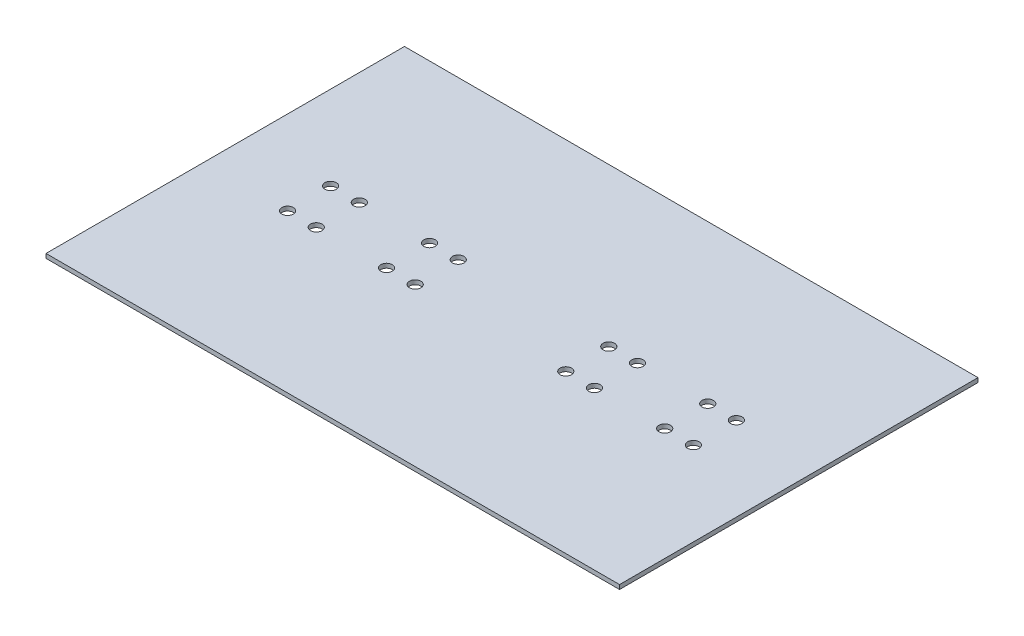
ISO-10303-21;
HEADER;
FILE_DESCRIPTION(('STEP AP214'),'2;1');
FILE_NAME('part.step','',(''),(''),'','','');
FILE_SCHEMA(('AUTOMOTIVE_DESIGN { 1 0 10303 214 1 1 1 1 }'));
ENDSEC;
DATA;
#1=APPLICATION_CONTEXT('core data for automotive mechanical design processes');
#2=APPLICATION_PROTOCOL_DEFINITION('international standard','automotive_design',2000,#1);
#3=PRODUCT_CONTEXT('',#1,'mechanical');
#4=PRODUCT('Part','Part','',(#3));
#5=PRODUCT_RELATED_PRODUCT_CATEGORY('part','',(#4));
#6=PRODUCT_DEFINITION_FORMATION('','',#4);
#7=PRODUCT_DEFINITION_CONTEXT('part definition',#1,'design');
#8=PRODUCT_DEFINITION('design','',#6,#7);
#9=PRODUCT_DEFINITION_SHAPE('','',#8);
#10=(LENGTH_UNIT() NAMED_UNIT(*) SI_UNIT(.MILLI.,.METRE.));
#11=(NAMED_UNIT(*) PLANE_ANGLE_UNIT() SI_UNIT($,.RADIAN.));
#12=(NAMED_UNIT(*) SI_UNIT($,.STERADIAN.) SOLID_ANGLE_UNIT());
#13=UNCERTAINTY_MEASURE_WITH_UNIT(LENGTH_MEASURE(1.E-05),#10,'distance_accuracy_value','');
#14=(GEOMETRIC_REPRESENTATION_CONTEXT(3) GLOBAL_UNCERTAINTY_ASSIGNED_CONTEXT((#13)) GLOBAL_UNIT_ASSIGNED_CONTEXT((#10,
#11,#12)) REPRESENTATION_CONTEXT('',''));
#15=CARTESIAN_POINT('',(0.,0.,0.));
#16=DIRECTION('',(0.,0.,1.));
#17=DIRECTION('',(1.,0.,0.));
#18=AXIS2_PLACEMENT_3D('',#15,#16,#17);
#19=CARTESIAN_POINT('',(200.,3.,125.));
#20=DIRECTION('',(-1.,0.,0.));
#21=DIRECTION('',(0.,0.,1.));
#22=AXIS2_PLACEMENT_3D('',#19,#20,#21);
#23=PLANE('',#22);
#24=DIRECTION('',(0.,0.,-1.));
#25=VECTOR('',#24,1.);
#26=CARTESIAN_POINT('',(200.,0.,125.));
#27=LINE('',#26,#25);
#28=CARTESIAN_POINT('',(200.,0.,125.));
#29=VERTEX_POINT('',#28);
#30=CARTESIAN_POINT('',(200.,0.,-125.));
#31=VERTEX_POINT('',#30);
#32=EDGE_CURVE('E101',#29,#31,#27,.T.);
#33=ORIENTED_EDGE('',*,*,#32,.T.);
#34=DIRECTION('',(0.,-1.,0.));
#35=VECTOR('',#34,1.);
#36=CARTESIAN_POINT('',(200.,3.,-125.));
#37=LINE('',#36,#35);
#38=CARTESIAN_POINT('',(200.,3.,-125.));
#39=VERTEX_POINT('',#38);
#40=EDGE_CURVE('E11',#39,#31,#37,.T.);
#41=ORIENTED_EDGE('',*,*,#40,.F.);
#42=DIRECTION('',(0.,0.,-1.));
#43=VECTOR('',#42,1.);
#44=CARTESIAN_POINT('',(200.,3.,125.));
#45=LINE('',#44,#43);
#46=CARTESIAN_POINT('',(200.,3.,125.));
#47=VERTEX_POINT('',#46);
#48=EDGE_CURVE('E89',#47,#39,#45,.T.);
#49=ORIENTED_EDGE('',*,*,#48,.F.);
#50=DIRECTION('',(0.,-1.,0.));
#51=VECTOR('',#50,1.);
#52=CARTESIAN_POINT('',(200.,3.,125.));
#53=LINE('',#52,#51);
#54=EDGE_CURVE('E97',#47,#29,#53,.T.);
#55=ORIENTED_EDGE('',*,*,#54,.T.);
#56=EDGE_LOOP('',(#33,#41,#49,#55));
#57=FACE_BOUND('',#56,.T.);
#58=ADVANCED_FACE('F38',(#57),#23,.F.);
#59=CARTESIAN_POINT('',(-200.,3.,-125.));
#60=DIRECTION('',(0.,0.,1.));
#61=DIRECTION('',(1.,0.,0.));
#62=AXIS2_PLACEMENT_3D('',#59,#60,#61);
#63=PLANE('',#62);
#64=DIRECTION('',(-1.,0.,0.));
#65=VECTOR('',#64,1.);
#66=CARTESIAN_POINT('',(-200.,0.,-125.));
#67=LINE('',#66,#65);
#68=CARTESIAN_POINT('',(-200.,0.,-125.));
#69=VERTEX_POINT('',#68);
#70=EDGE_CURVE('E93',#31,#69,#67,.T.);
#71=ORIENTED_EDGE('',*,*,#70,.T.);
#72=DIRECTION('',(0.,-1.,0.));
#73=VECTOR('',#72,1.);
#74=CARTESIAN_POINT('',(-200.,3.,-125.));
#75=LINE('',#74,#73);
#76=CARTESIAN_POINT('',(-200.,3.,-125.));
#77=VERTEX_POINT('',#76);
#78=EDGE_CURVE('E46',#77,#69,#75,.T.);
#79=ORIENTED_EDGE('',*,*,#78,.F.);
#80=DIRECTION('',(-1.,0.,0.));
#81=VECTOR('',#80,1.);
#82=CARTESIAN_POINT('',(-200.,3.,-125.));
#83=LINE('',#82,#81);
#84=EDGE_CURVE('E84',#39,#77,#83,.T.);
#85=ORIENTED_EDGE('',*,*,#84,.F.);
#86=ORIENTED_EDGE('',*,*,#40,.T.);
#87=EDGE_LOOP('',(#71,#79,#85,#86));
#88=FACE_BOUND('',#87,.T.);
#89=ADVANCED_FACE('F92',(#88),#63,.F.);
#90=CARTESIAN_POINT('',(-200.,3.,125.));
#91=DIRECTION('',(1.,0.,0.));
#92=DIRECTION('',(0.,0.,-1.));
#93=AXIS2_PLACEMENT_3D('',#90,#91,#92);
#94=PLANE('',#93);
#95=DIRECTION('',(0.,0.,1.));
#96=VECTOR('',#95,1.);
#97=CARTESIAN_POINT('',(-200.,0.,125.));
#98=LINE('',#97,#96);
#99=CARTESIAN_POINT('',(-200.,0.,125.));
#100=VERTEX_POINT('',#99);
#101=EDGE_CURVE('E71',#69,#100,#98,.T.);
#102=ORIENTED_EDGE('',*,*,#101,.T.);
#103=DIRECTION('',(0.,-1.,0.));
#104=VECTOR('',#103,1.);
#105=CARTESIAN_POINT('',(-200.,3.,125.));
#106=LINE('',#105,#104);
#107=CARTESIAN_POINT('',(-200.,3.,125.));
#108=VERTEX_POINT('',#107);
#109=EDGE_CURVE('E94',#108,#100,#106,.T.);
#110=ORIENTED_EDGE('',*,*,#109,.F.);
#111=DIRECTION('',(0.,0.,1.));
#112=VECTOR('',#111,1.);
#113=CARTESIAN_POINT('',(-200.,3.,125.));
#114=LINE('',#113,#112);
#115=EDGE_CURVE('E87',#77,#108,#114,.T.);
#116=ORIENTED_EDGE('',*,*,#115,.F.);
#117=ORIENTED_EDGE('',*,*,#78,.T.);
#118=EDGE_LOOP('',(#102,#110,#116,#117));
#119=FACE_BOUND('',#118,.T.);
#120=ADVANCED_FACE('F95',(#119),#94,.F.);
#121=CARTESIAN_POINT('',(-200.,3.,125.));
#122=DIRECTION('',(0.,0.,-1.));
#123=DIRECTION('',(-1.,0.,0.));
#124=AXIS2_PLACEMENT_3D('',#121,#122,#123);
#125=PLANE('',#124);
#126=DIRECTION('',(1.,0.,0.));
#127=VECTOR('',#126,1.);
#128=CARTESIAN_POINT('',(-200.,0.,125.));
#129=LINE('',#128,#127);
#130=EDGE_CURVE('E77',#100,#29,#129,.T.);
#131=ORIENTED_EDGE('',*,*,#130,.T.);
#132=ORIENTED_EDGE('',*,*,#54,.F.);
#133=DIRECTION('',(1.,0.,0.));
#134=VECTOR('',#133,1.);
#135=CARTESIAN_POINT('',(-200.,3.,125.));
#136=LINE('',#135,#134);
#137=EDGE_CURVE('E54',#108,#47,#136,.T.);
#138=ORIENTED_EDGE('',*,*,#137,.F.);
#139=ORIENTED_EDGE('',*,*,#109,.T.);
#140=EDGE_LOOP('',(#131,#132,#138,#139));
#141=FACE_BOUND('',#140,.T.);
#142=ADVANCED_FACE('F109',(#141),#125,.F.);
#143=CARTESIAN_POINT('',(0.,3.,0.));
#144=DIRECTION('',(0.,-1.,0.));
#145=DIRECTION('',(0.,0.,-1.));
#146=AXIS2_PLACEMENT_3D('',#143,#144,#145);
#147=PLANE('',#146);
#148=CARTESIAN_POINT('',(-52.5,3.,-15.));
#149=DIRECTION('',(0.,1.,0.));
#150=DIRECTION('',(0.,0.,-1.));
#151=AXIS2_PLACEMENT_3D('',#148,#149,#150);
#152=CIRCLE('',#151,4.00000000000001);
#153=CARTESIAN_POINT('',(-52.5,3.,-19.));
#154=VERTEX_POINT('',#153);
#155=EDGE_CURVE('E152',#154,#154,#152,.T.);
#156=ORIENTED_EDGE('',*,*,#155,.F.);
#157=EDGE_LOOP('',(#156));
#158=FACE_BOUND('',#157,.T.);
#159=CARTESIAN_POINT('',(52.5000000000001,3.,15.));
#160=DIRECTION('',(0.,1.,0.));
#161=DIRECTION('',(0.,0.,1.));
#162=AXIS2_PLACEMENT_3D('',#159,#160,#161);
#163=CIRCLE('',#162,4.);
#164=CARTESIAN_POINT('',(52.5000000000001,3.,19.));
#165=VERTEX_POINT('',#164);
#166=EDGE_CURVE('E145',#165,#165,#163,.T.);
#167=ORIENTED_EDGE('',*,*,#166,.F.);
#168=EDGE_LOOP('',(#167));
#169=FACE_BOUND('',#168,.T.);
#170=CARTESIAN_POINT('',(-72.4999999999999,3.,-15.));
#171=DIRECTION('',(0.,1.,0.));
#172=DIRECTION('',(0.,0.,-1.));
#173=AXIS2_PLACEMENT_3D('',#170,#171,#172);
#174=CIRCLE('',#173,4.00000000000001);
#175=CARTESIAN_POINT('',(-72.4999999999999,3.,-19.));
#176=VERTEX_POINT('',#175);
#177=EDGE_CURVE('E164',#176,#176,#174,.T.);
#178=ORIENTED_EDGE('',*,*,#177,.F.);
#179=EDGE_LOOP('',(#178));
#180=FACE_BOUND('',#179,.T.);
#181=CARTESIAN_POINT('',(121.5,3.,-15.));
#182=DIRECTION('',(0.,1.,0.));
#183=DIRECTION('',(0.,0.,1.));
#184=AXIS2_PLACEMENT_3D('',#181,#182,#183);
#185=CIRCLE('',#184,3.99999999999999);
#186=CARTESIAN_POINT('',(121.5,3.,-11.));
#187=VERTEX_POINT('',#186);
#188=EDGE_CURVE('E157',#187,#187,#185,.T.);
#189=ORIENTED_EDGE('',*,*,#188,.F.);
#190=EDGE_LOOP('',(#189));
#191=FACE_BOUND('',#190,.T.);
#192=CARTESIAN_POINT('',(-72.4999999999999,3.,15.));
#193=DIRECTION('',(0.,1.,0.));
#194=DIRECTION('',(0.,0.,-1.));
#195=AXIS2_PLACEMENT_3D('',#192,#193,#194);
#196=CIRCLE('',#195,4.00000000000001);
#197=CARTESIAN_POINT('',(-72.4999999999999,3.,11.));
#198=VERTEX_POINT('',#197);
#199=EDGE_CURVE('E128',#198,#198,#196,.T.);
#200=ORIENTED_EDGE('',*,*,#199,.F.);
#201=EDGE_LOOP('',(#200));
#202=FACE_BOUND('',#201,.T.);
#203=CARTESIAN_POINT('',(72.5,3.,-15.));
#204=DIRECTION('',(0.,1.,0.));
#205=DIRECTION('',(0.,0.,1.));
#206=AXIS2_PLACEMENT_3D('',#203,#204,#205);
#207=CIRCLE('',#206,4.00000000000001);
#208=CARTESIAN_POINT('',(72.5,3.,-11.));
#209=VERTEX_POINT('',#208);
#210=EDGE_CURVE('E121',#209,#209,#207,.T.);
#211=ORIENTED_EDGE('',*,*,#210,.F.);
#212=EDGE_LOOP('',(#211));
#213=FACE_BOUND('',#212,.T.);
#214=CARTESIAN_POINT('',(52.5000000000001,3.,-15.));
#215=DIRECTION('',(0.,1.,0.));
#216=DIRECTION('',(0.,0.,1.));
#217=AXIS2_PLACEMENT_3D('',#214,#215,#216);
#218=CIRCLE('',#217,4.00000000000001);
#219=CARTESIAN_POINT('',(52.5000000000001,3.,-11.));
#220=VERTEX_POINT('',#219);
#221=EDGE_CURVE('E140',#220,#220,#218,.T.);
#222=ORIENTED_EDGE('',*,*,#221,.F.);
#223=EDGE_LOOP('',(#222));
#224=FACE_BOUND('',#223,.T.);
#225=CARTESIAN_POINT('',(72.5,3.,15.));
#226=DIRECTION('',(0.,1.,0.));
#227=DIRECTION('',(0.,0.,1.));
#228=AXIS2_PLACEMENT_3D('',#225,#226,#227);
#229=CIRCLE('',#228,4.00000000000001);
#230=CARTESIAN_POINT('',(72.5,3.,19.));
#231=VERTEX_POINT('',#230);
#232=EDGE_CURVE('E133',#231,#231,#229,.T.);
#233=ORIENTED_EDGE('',*,*,#232,.F.);
#234=EDGE_LOOP('',(#233));
#235=FACE_BOUND('',#234,.T.);
#236=CARTESIAN_POINT('',(-121.5,3.,15.));
#237=DIRECTION('',(0.,1.,0.));
#238=DIRECTION('',(0.,0.,-1.));
#239=AXIS2_PLACEMENT_3D('',#236,#237,#238);
#240=CIRCLE('',#239,3.99999999999999);
#241=CARTESIAN_POINT('',(-121.5,3.,11.));
#242=VERTEX_POINT('',#241);
#243=EDGE_CURVE('E200',#242,#242,#240,.T.);
#244=ORIENTED_EDGE('',*,*,#243,.F.);
#245=EDGE_LOOP('',(#244));
#246=FACE_BOUND('',#245,.T.);
#247=CARTESIAN_POINT('',(-141.5,3.,-15.));
#248=DIRECTION('',(0.,1.,0.));
#249=DIRECTION('',(0.,0.,-1.));
#250=AXIS2_PLACEMENT_3D('',#247,#248,#249);
#251=CIRCLE('',#250,3.99999999999999);
#252=CARTESIAN_POINT('',(-141.5,3.,-19.));
#253=VERTEX_POINT('',#252);
#254=EDGE_CURVE('E193',#253,#253,#251,.T.);
#255=ORIENTED_EDGE('',*,*,#254,.F.);
#256=EDGE_LOOP('',(#255));
#257=FACE_BOUND('',#256,.T.);
#258=CARTESIAN_POINT('',(-121.5,3.,-15.));
#259=DIRECTION('',(0.,1.,0.));
#260=DIRECTION('',(0.,0.,-1.));
#261=AXIS2_PLACEMENT_3D('',#258,#259,#260);
#262=CIRCLE('',#261,3.99999999999999);
#263=CARTESIAN_POINT('',(-121.5,3.,-19.));
#264=VERTEX_POINT('',#263);
#265=EDGE_CURVE('E205',#264,#264,#262,.T.);
#266=ORIENTED_EDGE('',*,*,#265,.F.);
#267=EDGE_LOOP('',(#266));
#268=FACE_BOUND('',#267,.T.);
#269=CARTESIAN_POINT('',(141.5,3.,-15.));
#270=DIRECTION('',(0.,1.,0.));
#271=DIRECTION('',(0.,0.,1.));
#272=AXIS2_PLACEMENT_3D('',#269,#270,#271);
#273=CIRCLE('',#272,3.99999999999999);
#274=CARTESIAN_POINT('',(141.5,3.,-11.));
#275=VERTEX_POINT('',#274);
#276=EDGE_CURVE('E176',#275,#275,#273,.T.);
#277=ORIENTED_EDGE('',*,*,#276,.F.);
#278=EDGE_LOOP('',(#277));
#279=FACE_BOUND('',#278,.T.);
#280=CARTESIAN_POINT('',(121.5,3.,15.));
#281=DIRECTION('',(0.,1.,0.));
#282=DIRECTION('',(0.,0.,1.));
#283=AXIS2_PLACEMENT_3D('',#280,#281,#282);
#284=CIRCLE('',#283,3.99999999999999);
#285=CARTESIAN_POINT('',(121.5,3.,19.));
#286=VERTEX_POINT('',#285);
#287=EDGE_CURVE('E169',#286,#286,#284,.T.);
#288=ORIENTED_EDGE('',*,*,#287,.F.);
#289=EDGE_LOOP('',(#288));
#290=FACE_BOUND('',#289,.T.);
#291=CARTESIAN_POINT('',(141.5,3.,15.));
#292=DIRECTION('',(0.,1.,0.));
#293=DIRECTION('',(0.,0.,1.));
#294=AXIS2_PLACEMENT_3D('',#291,#292,#293);
#295=CIRCLE('',#294,3.99999999999999);
#296=CARTESIAN_POINT('',(141.5,3.,19.));
#297=VERTEX_POINT('',#296);
#298=EDGE_CURVE('E188',#297,#297,#295,.T.);
#299=ORIENTED_EDGE('',*,*,#298,.F.);
#300=EDGE_LOOP('',(#299));
#301=FACE_BOUND('',#300,.T.);
#302=CARTESIAN_POINT('',(-141.5,3.,15.));
#303=DIRECTION('',(0.,1.,0.));
#304=DIRECTION('',(0.,0.,-1.));
#305=AXIS2_PLACEMENT_3D('',#302,#303,#304);
#306=CIRCLE('',#305,3.99999999999999);
#307=CARTESIAN_POINT('',(-141.5,3.,11.));
#308=VERTEX_POINT('',#307);
#309=EDGE_CURVE('E181',#308,#308,#306,.T.);
#310=ORIENTED_EDGE('',*,*,#309,.F.);
#311=EDGE_LOOP('',(#310));
#312=FACE_BOUND('',#311,.T.);
#313=CARTESIAN_POINT('',(-52.5,3.,15.));
#314=DIRECTION('',(0.,1.,0.));
#315=DIRECTION('',(0.,0.,-1.));
#316=AXIS2_PLACEMENT_3D('',#313,#314,#315);
#317=CIRCLE('',#316,4.);
#318=CARTESIAN_POINT('',(-52.5,3.,11.));
#319=VERTEX_POINT('',#318);
#320=EDGE_CURVE('E115',#319,#319,#317,.T.);
#321=ORIENTED_EDGE('',*,*,#320,.F.);
#322=EDGE_LOOP('',(#321));
#323=FACE_BOUND('',#322,.T.);
#324=ORIENTED_EDGE('',*,*,#48,.T.);
#325=ORIENTED_EDGE('',*,*,#84,.T.);
#326=ORIENTED_EDGE('',*,*,#115,.T.);
#327=ORIENTED_EDGE('',*,*,#137,.T.);
#328=EDGE_LOOP('',(#324,#325,#326,#327));
#329=FACE_BOUND('',#328,.T.);
#330=ADVANCED_FACE('F85',(#158,#169,#180,#191,#202,#213,#224,#235,#246,#257,#268,#279,#290,#301,
#312,#323,#329),#147,.F.);
#331=CARTESIAN_POINT('',(0.,0.,0.));
#332=DIRECTION('',(0.,-1.,0.));
#333=DIRECTION('',(0.,0.,-1.));
#334=AXIS2_PLACEMENT_3D('',#331,#332,#333);
#335=PLANE('',#334);
#336=CARTESIAN_POINT('',(-52.5,0.,-15.));
#337=DIRECTION('',(0.,1.,0.));
#338=DIRECTION('',(0.,0.,-1.));
#339=AXIS2_PLACEMENT_3D('',#336,#337,#338);
#340=CIRCLE('',#339,4.00000000000001);
#341=CARTESIAN_POINT('',(-52.5,0.,-19.));
#342=VERTEX_POINT('',#341);
#343=EDGE_CURVE('E137',#342,#342,#340,.T.);
#344=ORIENTED_EDGE('',*,*,#343,.T.);
#345=EDGE_LOOP('',(#344));
#346=FACE_BOUND('',#345,.T.);
#347=CARTESIAN_POINT('',(52.5000000000001,0.,15.));
#348=DIRECTION('',(0.,1.,0.));
#349=DIRECTION('',(0.,0.,1.));
#350=AXIS2_PLACEMENT_3D('',#347,#348,#349);
#351=CIRCLE('',#350,4.);
#352=CARTESIAN_POINT('',(52.5000000000001,0.,19.));
#353=VERTEX_POINT('',#352);
#354=EDGE_CURVE('E148',#353,#353,#351,.T.);
#355=ORIENTED_EDGE('',*,*,#354,.T.);
#356=EDGE_LOOP('',(#355));
#357=FACE_BOUND('',#356,.T.);
#358=CARTESIAN_POINT('',(-72.4999999999999,0.,-15.));
#359=DIRECTION('',(0.,1.,0.));
#360=DIRECTION('',(0.,0.,-1.));
#361=AXIS2_PLACEMENT_3D('',#358,#359,#360);
#362=CIRCLE('',#361,4.00000000000001);
#363=CARTESIAN_POINT('',(-72.4999999999999,0.,-19.));
#364=VERTEX_POINT('',#363);
#365=EDGE_CURVE('E149',#364,#364,#362,.T.);
#366=ORIENTED_EDGE('',*,*,#365,.T.);
#367=EDGE_LOOP('',(#366));
#368=FACE_BOUND('',#367,.T.);
#369=CARTESIAN_POINT('',(121.5,0.,-15.));
#370=DIRECTION('',(0.,1.,0.));
#371=DIRECTION('',(0.,0.,1.));
#372=AXIS2_PLACEMENT_3D('',#369,#370,#371);
#373=CIRCLE('',#372,3.99999999999999);
#374=CARTESIAN_POINT('',(121.5,0.,-11.));
#375=VERTEX_POINT('',#374);
#376=EDGE_CURVE('E160',#375,#375,#373,.T.);
#377=ORIENTED_EDGE('',*,*,#376,.T.);
#378=EDGE_LOOP('',(#377));
#379=FACE_BOUND('',#378,.T.);
#380=CARTESIAN_POINT('',(-72.4999999999999,0.,15.));
#381=DIRECTION('',(0.,1.,0.));
#382=DIRECTION('',(0.,0.,-1.));
#383=AXIS2_PLACEMENT_3D('',#380,#381,#382);
#384=CIRCLE('',#383,4.00000000000001);
#385=CARTESIAN_POINT('',(-72.4999999999999,0.,11.));
#386=VERTEX_POINT('',#385);
#387=EDGE_CURVE('E118',#386,#386,#384,.T.);
#388=ORIENTED_EDGE('',*,*,#387,.T.);
#389=EDGE_LOOP('',(#388));
#390=FACE_BOUND('',#389,.T.);
#391=CARTESIAN_POINT('',(72.5,0.,-15.));
#392=DIRECTION('',(0.,1.,0.));
#393=DIRECTION('',(0.,0.,1.));
#394=AXIS2_PLACEMENT_3D('',#391,#392,#393);
#395=CIRCLE('',#394,4.00000000000001);
#396=CARTESIAN_POINT('',(72.5,0.,-11.));
#397=VERTEX_POINT('',#396);
#398=EDGE_CURVE('E124',#397,#397,#395,.T.);
#399=ORIENTED_EDGE('',*,*,#398,.T.);
#400=EDGE_LOOP('',(#399));
#401=FACE_BOUND('',#400,.T.);
#402=CARTESIAN_POINT('',(52.5000000000001,0.,-15.));
#403=DIRECTION('',(0.,1.,0.));
#404=DIRECTION('',(0.,0.,1.));
#405=AXIS2_PLACEMENT_3D('',#402,#403,#404);
#406=CIRCLE('',#405,4.00000000000001);
#407=CARTESIAN_POINT('',(52.5000000000001,0.,-11.));
#408=VERTEX_POINT('',#407);
#409=EDGE_CURVE('E125',#408,#408,#406,.T.);
#410=ORIENTED_EDGE('',*,*,#409,.T.);
#411=EDGE_LOOP('',(#410));
#412=FACE_BOUND('',#411,.T.);
#413=CARTESIAN_POINT('',(72.5,0.,15.));
#414=DIRECTION('',(0.,1.,0.));
#415=DIRECTION('',(0.,0.,1.));
#416=AXIS2_PLACEMENT_3D('',#413,#414,#415);
#417=CIRCLE('',#416,4.00000000000001);
#418=CARTESIAN_POINT('',(72.5,0.,19.));
#419=VERTEX_POINT('',#418);
#420=EDGE_CURVE('E136',#419,#419,#417,.T.);
#421=ORIENTED_EDGE('',*,*,#420,.T.);
#422=EDGE_LOOP('',(#421));
#423=FACE_BOUND('',#422,.T.);
#424=CARTESIAN_POINT('',(-121.5,0.,15.));
#425=DIRECTION('',(0.,1.,0.));
#426=DIRECTION('',(0.,0.,-1.));
#427=AXIS2_PLACEMENT_3D('',#424,#425,#426);
#428=CIRCLE('',#427,3.99999999999999);
#429=CARTESIAN_POINT('',(-121.5,0.,11.));
#430=VERTEX_POINT('',#429);
#431=EDGE_CURVE('E185',#430,#430,#428,.T.);
#432=ORIENTED_EDGE('',*,*,#431,.T.);
#433=EDGE_LOOP('',(#432));
#434=FACE_BOUND('',#433,.T.);
#435=CARTESIAN_POINT('',(-141.5,0.,-15.));
#436=DIRECTION('',(0.,1.,0.));
#437=DIRECTION('',(0.,0.,-1.));
#438=AXIS2_PLACEMENT_3D('',#435,#436,#437);
#439=CIRCLE('',#438,3.99999999999999);
#440=CARTESIAN_POINT('',(-141.5,0.,-19.));
#441=VERTEX_POINT('',#440);
#442=EDGE_CURVE('E196',#441,#441,#439,.T.);
#443=ORIENTED_EDGE('',*,*,#442,.T.);
#444=EDGE_LOOP('',(#443));
#445=FACE_BOUND('',#444,.T.);
#446=CARTESIAN_POINT('',(-121.5,0.,-15.));
#447=DIRECTION('',(0.,1.,0.));
#448=DIRECTION('',(0.,0.,-1.));
#449=AXIS2_PLACEMENT_3D('',#446,#447,#448);
#450=CIRCLE('',#449,3.99999999999999);
#451=CARTESIAN_POINT('',(-121.5,0.,-19.));
#452=VERTEX_POINT('',#451);
#453=EDGE_CURVE('E197',#452,#452,#450,.T.);
#454=ORIENTED_EDGE('',*,*,#453,.T.);
#455=EDGE_LOOP('',(#454));
#456=FACE_BOUND('',#455,.T.);
#457=CARTESIAN_POINT('',(141.5,0.,-15.));
#458=DIRECTION('',(0.,1.,0.));
#459=DIRECTION('',(0.,0.,1.));
#460=AXIS2_PLACEMENT_3D('',#457,#458,#459);
#461=CIRCLE('',#460,3.99999999999999);
#462=CARTESIAN_POINT('',(141.5,0.,-11.));
#463=VERTEX_POINT('',#462);
#464=EDGE_CURVE('E161',#463,#463,#461,.T.);
#465=ORIENTED_EDGE('',*,*,#464,.T.);
#466=EDGE_LOOP('',(#465));
#467=FACE_BOUND('',#466,.T.);
#468=CARTESIAN_POINT('',(121.5,0.,15.));
#469=DIRECTION('',(0.,1.,0.));
#470=DIRECTION('',(0.,0.,1.));
#471=AXIS2_PLACEMENT_3D('',#468,#469,#470);
#472=CIRCLE('',#471,3.99999999999999);
#473=CARTESIAN_POINT('',(121.5,0.,19.));
#474=VERTEX_POINT('',#473);
#475=EDGE_CURVE('E172',#474,#474,#472,.T.);
#476=ORIENTED_EDGE('',*,*,#475,.T.);
#477=EDGE_LOOP('',(#476));
#478=FACE_BOUND('',#477,.T.);
#479=CARTESIAN_POINT('',(141.5,0.,15.));
#480=DIRECTION('',(0.,1.,0.));
#481=DIRECTION('',(0.,0.,1.));
#482=AXIS2_PLACEMENT_3D('',#479,#480,#481);
#483=CIRCLE('',#482,3.99999999999999);
#484=CARTESIAN_POINT('',(141.5,0.,19.));
#485=VERTEX_POINT('',#484);
#486=EDGE_CURVE('E173',#485,#485,#483,.T.);
#487=ORIENTED_EDGE('',*,*,#486,.T.);
#488=EDGE_LOOP('',(#487));
#489=FACE_BOUND('',#488,.T.);
#490=CARTESIAN_POINT('',(-141.5,0.,15.));
#491=DIRECTION('',(0.,1.,0.));
#492=DIRECTION('',(0.,0.,-1.));
#493=AXIS2_PLACEMENT_3D('',#490,#491,#492);
#494=CIRCLE('',#493,3.99999999999999);
#495=CARTESIAN_POINT('',(-141.5,0.,11.));
#496=VERTEX_POINT('',#495);
#497=EDGE_CURVE('E184',#496,#496,#494,.T.);
#498=ORIENTED_EDGE('',*,*,#497,.T.);
#499=EDGE_LOOP('',(#498));
#500=FACE_BOUND('',#499,.T.);
#501=CARTESIAN_POINT('',(-52.5,0.,15.));
#502=DIRECTION('',(0.,1.,0.));
#503=DIRECTION('',(0.,0.,-1.));
#504=AXIS2_PLACEMENT_3D('',#501,#502,#503);
#505=CIRCLE('',#504,4.);
#506=CARTESIAN_POINT('',(-52.5,0.,11.));
#507=VERTEX_POINT('',#506);
#508=EDGE_CURVE('E104',#507,#507,#505,.T.);
#509=ORIENTED_EDGE('',*,*,#508,.T.);
#510=EDGE_LOOP('',(#509));
#511=FACE_BOUND('',#510,.T.);
#512=ORIENTED_EDGE('',*,*,#32,.F.);
#513=ORIENTED_EDGE('',*,*,#130,.F.);
#514=ORIENTED_EDGE('',*,*,#101,.F.);
#515=ORIENTED_EDGE('',*,*,#70,.F.);
#516=EDGE_LOOP('',(#512,#513,#514,#515));
#517=FACE_BOUND('',#516,.T.);
#518=ADVANCED_FACE('F112',(#346,#357,#368,#379,#390,#401,#412,#423,#434,#445,#456,#467,#478,
#489,#500,#511,#517),#335,.T.);
#519=CARTESIAN_POINT('',(-52.5,0.,15.));
#520=DIRECTION('',(0.,1.,0.));
#521=DIRECTION('',(0.,0.,1.));
#522=AXIS2_PLACEMENT_3D('',#519,#520,#521);
#523=CYLINDRICAL_SURFACE('',#522,4.);
#524=ORIENTED_EDGE('',*,*,#508,.F.);
#525=EDGE_LOOP('',(#524));
#526=FACE_BOUND('',#525,.T.);
#527=ORIENTED_EDGE('',*,*,#320,.T.);
#528=EDGE_LOOP('',(#527));
#529=FACE_BOUND('',#528,.T.);
#530=ADVANCED_FACE('F235',(#526,#529),#523,.F.);
#531=CARTESIAN_POINT('',(-141.5,0.,15.));
#532=DIRECTION('',(0.,1.,0.));
#533=DIRECTION('',(0.,0.,1.));
#534=AXIS2_PLACEMENT_3D('',#531,#532,#533);
#535=CYLINDRICAL_SURFACE('',#534,3.99999999999999);
#536=ORIENTED_EDGE('',*,*,#497,.F.);
#537=EDGE_LOOP('',(#536));
#538=FACE_BOUND('',#537,.T.);
#539=ORIENTED_EDGE('',*,*,#309,.T.);
#540=EDGE_LOOP('',(#539));
#541=FACE_BOUND('',#540,.T.);
#542=ADVANCED_FACE('F237',(#538,#541),#535,.F.);
#543=CARTESIAN_POINT('',(141.5,0.,15.));
#544=DIRECTION('',(0.,1.,0.));
#545=DIRECTION('',(0.,0.,1.));
#546=AXIS2_PLACEMENT_3D('',#543,#544,#545);
#547=CYLINDRICAL_SURFACE('',#546,3.99999999999999);
#548=ORIENTED_EDGE('',*,*,#486,.F.);
#549=EDGE_LOOP('',(#548));
#550=FACE_BOUND('',#549,.T.);
#551=ORIENTED_EDGE('',*,*,#298,.T.);
#552=EDGE_LOOP('',(#551));
#553=FACE_BOUND('',#552,.T.);
#554=ADVANCED_FACE('F244',(#550,#553),#547,.F.);
#555=CARTESIAN_POINT('',(121.5,0.,15.));
#556=DIRECTION('',(0.,1.,0.));
#557=DIRECTION('',(0.,0.,1.));
#558=AXIS2_PLACEMENT_3D('',#555,#556,#557);
#559=CYLINDRICAL_SURFACE('',#558,3.99999999999999);
#560=ORIENTED_EDGE('',*,*,#475,.F.);
#561=EDGE_LOOP('',(#560));
#562=FACE_BOUND('',#561,.T.);
#563=ORIENTED_EDGE('',*,*,#287,.T.);
#564=EDGE_LOOP('',(#563));
#565=FACE_BOUND('',#564,.T.);
#566=ADVANCED_FACE('F292',(#562,#565),#559,.F.);
#567=CARTESIAN_POINT('',(141.5,0.,-15.));
#568=DIRECTION('',(0.,1.,0.));
#569=DIRECTION('',(0.,0.,1.));
#570=AXIS2_PLACEMENT_3D('',#567,#568,#569);
#571=CYLINDRICAL_SURFACE('',#570,3.99999999999999);
#572=ORIENTED_EDGE('',*,*,#464,.F.);
#573=EDGE_LOOP('',(#572));
#574=FACE_BOUND('',#573,.T.);
#575=ORIENTED_EDGE('',*,*,#276,.T.);
#576=EDGE_LOOP('',(#575));
#577=FACE_BOUND('',#576,.T.);
#578=ADVANCED_FACE('F217',(#574,#577),#571,.F.);
#579=CARTESIAN_POINT('',(-121.5,0.,-15.));
#580=DIRECTION('',(0.,1.,0.));
#581=DIRECTION('',(0.,0.,1.));
#582=AXIS2_PLACEMENT_3D('',#579,#580,#581);
#583=CYLINDRICAL_SURFACE('',#582,3.99999999999999);
#584=ORIENTED_EDGE('',*,*,#453,.F.);
#585=EDGE_LOOP('',(#584));
#586=FACE_BOUND('',#585,.T.);
#587=ORIENTED_EDGE('',*,*,#265,.T.);
#588=EDGE_LOOP('',(#587));
#589=FACE_BOUND('',#588,.T.);
#590=ADVANCED_FACE('F213',(#586,#589),#583,.F.);
#591=CARTESIAN_POINT('',(-141.5,0.,-15.));
#592=DIRECTION('',(0.,1.,0.));
#593=DIRECTION('',(0.,0.,1.));
#594=AXIS2_PLACEMENT_3D('',#591,#592,#593);
#595=CYLINDRICAL_SURFACE('',#594,3.99999999999999);
#596=ORIENTED_EDGE('',*,*,#442,.F.);
#597=EDGE_LOOP('',(#596));
#598=FACE_BOUND('',#597,.T.);
#599=ORIENTED_EDGE('',*,*,#254,.T.);
#600=EDGE_LOOP('',(#599));
#601=FACE_BOUND('',#600,.T.);
#602=ADVANCED_FACE('F216',(#598,#601),#595,.F.);
#603=CARTESIAN_POINT('',(-121.5,0.,15.));
#604=DIRECTION('',(0.,1.,0.));
#605=DIRECTION('',(0.,0.,1.));
#606=AXIS2_PLACEMENT_3D('',#603,#604,#605);
#607=CYLINDRICAL_SURFACE('',#606,3.99999999999999);
#608=ORIENTED_EDGE('',*,*,#431,.F.);
#609=EDGE_LOOP('',(#608));
#610=FACE_BOUND('',#609,.T.);
#611=ORIENTED_EDGE('',*,*,#243,.T.);
#612=EDGE_LOOP('',(#611));
#613=FACE_BOUND('',#612,.T.);
#614=ADVANCED_FACE('F326',(#610,#613),#607,.F.);
#615=CARTESIAN_POINT('',(72.5,0.,15.));
#616=DIRECTION('',(0.,1.,0.));
#617=DIRECTION('',(0.,0.,1.));
#618=AXIS2_PLACEMENT_3D('',#615,#616,#617);
#619=CYLINDRICAL_SURFACE('',#618,4.00000000000001);
#620=ORIENTED_EDGE('',*,*,#420,.F.);
#621=EDGE_LOOP('',(#620));
#622=FACE_BOUND('',#621,.T.);
#623=ORIENTED_EDGE('',*,*,#232,.T.);
#624=EDGE_LOOP('',(#623));
#625=FACE_BOUND('',#624,.T.);
#626=ADVANCED_FACE('F336',(#622,#625),#619,.F.);
#627=CARTESIAN_POINT('',(52.5000000000001,0.,-15.));
#628=DIRECTION('',(0.,1.,0.));
#629=DIRECTION('',(0.,0.,1.));
#630=AXIS2_PLACEMENT_3D('',#627,#628,#629);
#631=CYLINDRICAL_SURFACE('',#630,4.00000000000001);
#632=ORIENTED_EDGE('',*,*,#409,.F.);
#633=EDGE_LOOP('',(#632));
#634=FACE_BOUND('',#633,.T.);
#635=ORIENTED_EDGE('',*,*,#221,.T.);
#636=EDGE_LOOP('',(#635));
#637=FACE_BOUND('',#636,.T.);
#638=ADVANCED_FACE('F346',(#634,#637),#631,.F.);
#639=CARTESIAN_POINT('',(72.5,0.,-15.));
#640=DIRECTION('',(0.,1.,0.));
#641=DIRECTION('',(0.,0.,1.));
#642=AXIS2_PLACEMENT_3D('',#639,#640,#641);
#643=CYLINDRICAL_SURFACE('',#642,4.00000000000001);
#644=ORIENTED_EDGE('',*,*,#398,.F.);
#645=EDGE_LOOP('',(#644));
#646=FACE_BOUND('',#645,.T.);
#647=ORIENTED_EDGE('',*,*,#210,.T.);
#648=EDGE_LOOP('',(#647));
#649=FACE_BOUND('',#648,.T.);
#650=ADVANCED_FACE('F356',(#646,#649),#643,.F.);
#651=CARTESIAN_POINT('',(-72.4999999999999,0.,15.));
#652=DIRECTION('',(0.,1.,0.));
#653=DIRECTION('',(0.,0.,1.));
#654=AXIS2_PLACEMENT_3D('',#651,#652,#653);
#655=CYLINDRICAL_SURFACE('',#654,4.00000000000001);
#656=ORIENTED_EDGE('',*,*,#387,.F.);
#657=EDGE_LOOP('',(#656));
#658=FACE_BOUND('',#657,.T.);
#659=ORIENTED_EDGE('',*,*,#199,.T.);
#660=EDGE_LOOP('',(#659));
#661=FACE_BOUND('',#660,.T.);
#662=ADVANCED_FACE('F366',(#658,#661),#655,.F.);
#663=CARTESIAN_POINT('',(121.5,0.,-15.));
#664=DIRECTION('',(0.,1.,0.));
#665=DIRECTION('',(0.,0.,1.));
#666=AXIS2_PLACEMENT_3D('',#663,#664,#665);
#667=CYLINDRICAL_SURFACE('',#666,3.99999999999999);
#668=ORIENTED_EDGE('',*,*,#376,.F.);
#669=EDGE_LOOP('',(#668));
#670=FACE_BOUND('',#669,.T.);
#671=ORIENTED_EDGE('',*,*,#188,.T.);
#672=EDGE_LOOP('',(#671));
#673=FACE_BOUND('',#672,.T.);
#674=ADVANCED_FACE('F375',(#670,#673),#667,.F.);
#675=CARTESIAN_POINT('',(-72.4999999999999,0.,-15.));
#676=DIRECTION('',(0.,1.,0.));
#677=DIRECTION('',(0.,0.,1.));
#678=AXIS2_PLACEMENT_3D('',#675,#676,#677);
#679=CYLINDRICAL_SURFACE('',#678,4.00000000000001);
#680=ORIENTED_EDGE('',*,*,#365,.F.);
#681=EDGE_LOOP('',(#680));
#682=FACE_BOUND('',#681,.T.);
#683=ORIENTED_EDGE('',*,*,#177,.T.);
#684=EDGE_LOOP('',(#683));
#685=FACE_BOUND('',#684,.T.);
#686=ADVANCED_FACE('F385',(#682,#685),#679,.F.);
#687=CARTESIAN_POINT('',(52.5000000000001,0.,15.));
#688=DIRECTION('',(0.,1.,0.));
#689=DIRECTION('',(0.,0.,1.));
#690=AXIS2_PLACEMENT_3D('',#687,#688,#689);
#691=CYLINDRICAL_SURFACE('',#690,4.);
#692=ORIENTED_EDGE('',*,*,#354,.F.);
#693=EDGE_LOOP('',(#692));
#694=FACE_BOUND('',#693,.T.);
#695=ORIENTED_EDGE('',*,*,#166,.T.);
#696=EDGE_LOOP('',(#695));
#697=FACE_BOUND('',#696,.T.);
#698=ADVANCED_FACE('F395',(#694,#697),#691,.F.);
#699=CARTESIAN_POINT('',(-52.5,0.,-15.));
#700=DIRECTION('',(0.,1.,0.));
#701=DIRECTION('',(0.,0.,1.));
#702=AXIS2_PLACEMENT_3D('',#699,#700,#701);
#703=CYLINDRICAL_SURFACE('',#702,4.00000000000001);
#704=ORIENTED_EDGE('',*,*,#343,.F.);
#705=EDGE_LOOP('',(#704));
#706=FACE_BOUND('',#705,.T.);
#707=ORIENTED_EDGE('',*,*,#155,.T.);
#708=EDGE_LOOP('',(#707));
#709=FACE_BOUND('',#708,.T.);
#710=ADVANCED_FACE('F405',(#706,#709),#703,.F.);
#711=CLOSED_SHELL('',(#58,#89,#120,#142,#330,#518,#530,#542,#554,#566,#578,#590,#602,#614,#626,
#638,#650,#662,#674,#686,#698,#710));
#712=MANIFOLD_SOLID_BREP('B2',#711);
#713=ADVANCED_BREP_SHAPE_REPRESENTATION('',(#18,#712),#14);
#714=SHAPE_DEFINITION_REPRESENTATION(#9,#713);
ENDSEC;
END-ISO-10303-21;
